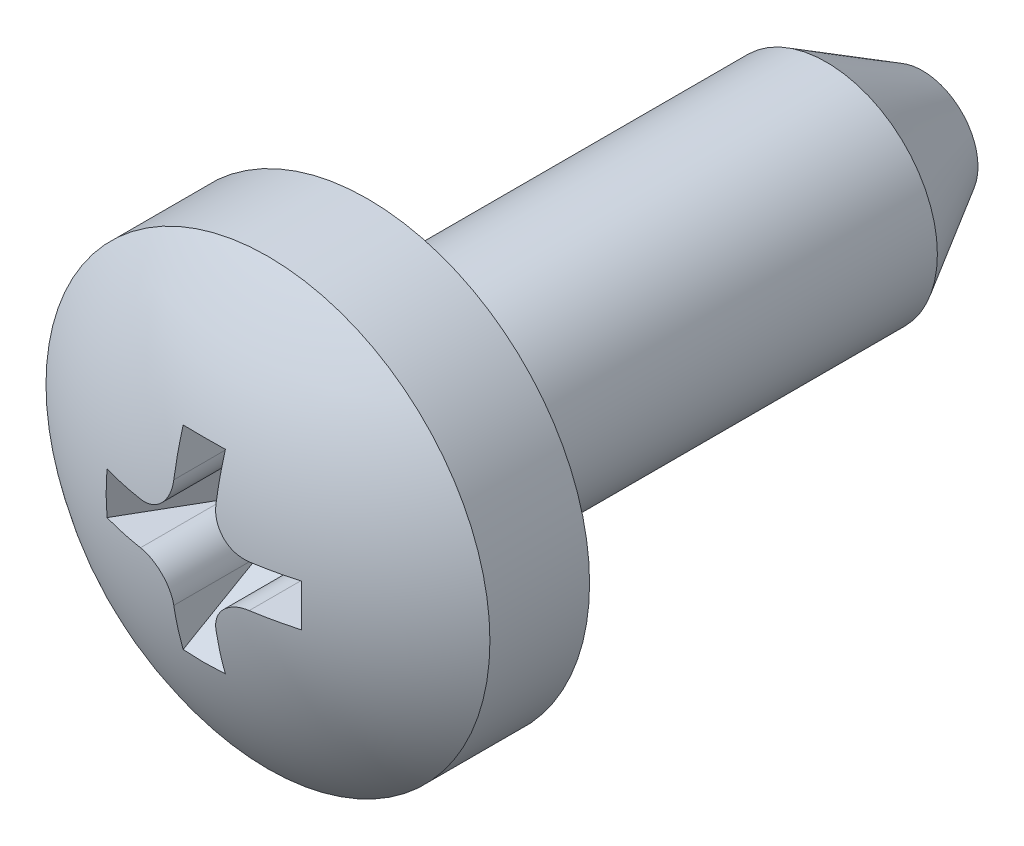
ISO-10303-21;
HEADER;
FILE_DESCRIPTION(('STEP AP214'),'2;1');
FILE_NAME('part.step','',(''),(''),'','','');
FILE_SCHEMA(('AUTOMOTIVE_DESIGN { 1 0 10303 214 1 1 1 1 }'));
ENDSEC;
DATA;
#1=APPLICATION_CONTEXT('core data for automotive mechanical design processes');
#2=APPLICATION_PROTOCOL_DEFINITION('international standard','automotive_design',2000,#1);
#3=PRODUCT_CONTEXT('',#1,'mechanical');
#4=PRODUCT('Part','Part','',(#3));
#5=PRODUCT_RELATED_PRODUCT_CATEGORY('part','',(#4));
#6=PRODUCT_DEFINITION_FORMATION('','',#4);
#7=PRODUCT_DEFINITION_CONTEXT('part definition',#1,'design');
#8=PRODUCT_DEFINITION('design','',#6,#7);
#9=PRODUCT_DEFINITION_SHAPE('','',#8);
#10=(LENGTH_UNIT() NAMED_UNIT(*) SI_UNIT(.MILLI.,.METRE.));
#11=(NAMED_UNIT(*) PLANE_ANGLE_UNIT() SI_UNIT($,.RADIAN.));
#12=(NAMED_UNIT(*) SI_UNIT($,.STERADIAN.) SOLID_ANGLE_UNIT());
#13=UNCERTAINTY_MEASURE_WITH_UNIT(LENGTH_MEASURE(1.E-05),#10,'distance_accuracy_value','');
#14=(GEOMETRIC_REPRESENTATION_CONTEXT(3) GLOBAL_UNCERTAINTY_ASSIGNED_CONTEXT((#13)) GLOBAL_UNIT_ASSIGNED_CONTEXT((#10,
#11,#12)) REPRESENTATION_CONTEXT('',''));
#15=CARTESIAN_POINT('',(0.,0.,0.));
#16=DIRECTION('',(0.,0.,1.));
#17=DIRECTION('',(1.,0.,0.));
#18=AXIS2_PLACEMENT_3D('',#15,#16,#17);
#19=CARTESIAN_POINT('',(0.,0.,-0.899999999999998));
#20=DIRECTION('',(0.,0.,1.));
#21=DIRECTION('',(1.,0.,0.));
#22=AXIS2_PLACEMENT_3D('',#19,#20,#21);
#23=PLANE('',#22);
#24=DIRECTION('',(0.,1.,0.));
#25=VECTOR('',#24,1.);
#26=CARTESIAN_POINT('',(0.430384757729351,0.,-0.900000000000006));
#27=LINE('',#26,#25);
#28=CARTESIAN_POINT('',(0.430384757729354,0.195982954764524,-0.900000000000002));
#29=VERTEX_POINT('',#28);
#30=CARTESIAN_POINT('',(0.430384757729353,-0.195982954764495,-0.900000000000002));
#31=VERTEX_POINT('',#30);
#32=EDGE_CURVE('E182',#29,#31,#27,.F.);
#33=ORIENTED_EDGE('',*,*,#32,.F.);
#34=CARTESIAN_POINT('',(0.490000000000011,0.490000000000018,-0.899999999999998));
#35=DIRECTION('',(0.,0.,1.));
#36=DIRECTION('',(1.,0.,0.));
#37=AXIS2_PLACEMENT_3D('',#34,#35,#36);
#38=CIRCLE('',#37,0.299999999999999);
#39=CARTESIAN_POINT('',(0.195982954764519,0.430384757729355,-0.899999999999994));
#40=VERTEX_POINT('',#39);
#41=EDGE_CURVE('E195',#40,#29,#38,.T.);
#42=ORIENTED_EDGE('',*,*,#41,.F.);
#43=DIRECTION('',(1.,0.,0.));
#44=VECTOR('',#43,1.);
#45=CARTESIAN_POINT('',(0.,0.430384757729357,-0.89999999999999));
#46=LINE('',#45,#44);
#47=CARTESIAN_POINT('',(-0.195982954764484,0.430384757729355,-0.899999999999994));
#48=VERTEX_POINT('',#47);
#49=EDGE_CURVE('E198',#48,#40,#46,.T.);
#50=ORIENTED_EDGE('',*,*,#49,.F.);
#51=CARTESIAN_POINT('',(-0.489999999999977,0.490000000000018,-0.899999999999998));
#52=DIRECTION('',(0.,0.,1.));
#53=DIRECTION('',(1.,0.,0.));
#54=AXIS2_PLACEMENT_3D('',#51,#52,#53);
#55=CIRCLE('',#54,0.299999999999999);
#56=CARTESIAN_POINT('',(-0.430384757729338,0.19598295476452,-0.900000000000005));
#57=VERTEX_POINT('',#56);
#58=EDGE_CURVE('E423',#57,#48,#55,.T.);
#59=ORIENTED_EDGE('',*,*,#58,.F.);
#60=DIRECTION('',(0.,1.,0.));
#61=VECTOR('',#60,1.);
#62=CARTESIAN_POINT('',(-0.430384757729334,0.,-0.900000000000012));
#63=LINE('',#62,#61);
#64=CARTESIAN_POINT('',(-0.430384757729314,-0.195982954764488,-0.900000000000047));
#65=VERTEX_POINT('',#64);
#66=EDGE_CURVE('E148',#65,#57,#63,.T.);
#67=ORIENTED_EDGE('',*,*,#66,.F.);
#68=CARTESIAN_POINT('',(-0.489999999999997,-0.489999999999977,-0.900000000000081));
#69=DIRECTION('',(0.,0.,1.));
#70=DIRECTION('',(1.,0.,0.));
#71=AXIS2_PLACEMENT_3D('',#68,#69,#70);
#72=CIRCLE('',#71,0.299999999999999);
#73=CARTESIAN_POINT('',(-0.195982954764495,-0.430384757729361,-0.90000000000005));
#74=VERTEX_POINT('',#73);
#75=EDGE_CURVE('E141',#74,#65,#72,.T.);
#76=ORIENTED_EDGE('',*,*,#75,.F.);
#77=DIRECTION('',(1.,0.,0.));
#78=VECTOR('',#77,1.);
#79=CARTESIAN_POINT('',(0.,-0.430384757729379,-0.900000000000019));
#80=LINE('',#79,#78);
#81=CARTESIAN_POINT('',(0.1959829547645,-0.430384757729385,-0.900000000000008));
#82=VERTEX_POINT('',#81);
#83=EDGE_CURVE('E145',#82,#74,#80,.F.);
#84=ORIENTED_EDGE('',*,*,#83,.F.);
#85=CARTESIAN_POINT('',(0.490000000000004,-0.48999999999999,-0.899999999999998));
#86=DIRECTION('',(0.,0.,1.));
#87=DIRECTION('',(1.,0.,0.));
#88=AXIS2_PLACEMENT_3D('',#85,#86,#87);
#89=CIRCLE('',#88,0.299999999999999);
#90=EDGE_CURVE('E179',#31,#82,#89,.T.);
#91=ORIENTED_EDGE('',*,*,#90,.F.);
#92=EDGE_LOOP('',(#33,#42,#50,#59,#67,#76,#84,#91));
#93=FACE_BOUND('',#92,.T.);
#94=ADVANCED_FACE('F17',(#93),#23,.T.);
#95=CARTESIAN_POINT('',(-0.19000000000001,-0.949999999999993,-0.900000000000109));
#96=DIRECTION('',(-1.,0.,0.));
#97=DIRECTION('',(0.,-1.,0.));
#98=AXIS2_PLACEMENT_3D('',#95,#96,#97);
#99=PLANE('',#98);
#100=DIRECTION('',(0.,0.,1.));
#101=VECTOR('',#100,1.);
#102=CARTESIAN_POINT('',(-0.189999999999998,-0.489999999999977,-0.900000000000109));
#103=LINE('',#102,#101);
#104=CARTESIAN_POINT('',(-0.189999999999998,-0.489999999999989,-0.0434512517625087));
#105=VERTEX_POINT('',#104);
#106=CARTESIAN_POINT('',(-0.189999999999992,-0.489999999999976,-0.796743371481818));
#107=VERTEX_POINT('',#106);
#108=EDGE_CURVE('E152',#105,#107,#103,.F.);
#109=ORIENTED_EDGE('',*,*,#108,.F.);
#110=CARTESIAN_POINT('',(-0.19000000000001,-0.876031893359185,-0.128116518841));
#111=CARTESIAN_POINT('',(-0.19000000000001,-0.81256698402957,-0.110021819178724));
#112=CARTESIAN_POINT('',(-0.19000000000001,-0.748665204918164,-0.0939190304243743));
#113=CARTESIAN_POINT('',(-0.190000000000009,-0.619987907131769,-0.0656972747315268));
#114=CARTESIAN_POINT('',(-0.190000000000009,-0.555212388456781,-0.053578307793029));
#115=CARTESIAN_POINT('',(-0.190000000000008,-0.490000000000002,-0.0434512517624571));
#116=B_SPLINE_CURVE_WITH_KNOTS('',3,(#110,#111,#112,#113,#114,#115),.UNSPECIFIED.,.F.,.F.,(4,2,
4),(0.,0.197698342465058,0.395396684930116),.UNSPECIFIED.);
#117=CARTESIAN_POINT('',(-0.190000000000006,-0.876031893359321,-0.128116518841095));
#118=VERTEX_POINT('',#117);
#119=EDGE_CURVE('E278',#118,#105,#116,.T.);
#120=ORIENTED_EDGE('',*,*,#119,.F.);
#121=DIRECTION('',(0.,-0.500000000000002,0.866025403784437));
#122=VECTOR('',#121,1.);
#123=CARTESIAN_POINT('',(-0.189999999999975,-0.949999999999993,-1.11075038056185E-13));
#124=LINE('',#123,#122);
#125=EDGE_CURVE('E160',#107,#118,#124,.T.);
#126=ORIENTED_EDGE('',*,*,#125,.F.);
#127=EDGE_LOOP('',(#109,#120,#126));
#128=FACE_BOUND('',#127,.T.);
#129=ADVANCED_FACE('F485',(#128),#99,.F.);
#130=CARTESIAN_POINT('',(-0.489999999999997,-0.489999999999977,-0.900000000000109));
#131=DIRECTION('',(0.,0.,1.));
#132=DIRECTION('',(1.,0.,0.));
#133=AXIS2_PLACEMENT_3D('',#130,#131,#132);
#134=CYLINDRICAL_SURFACE('',#133,0.299999999999999);
#135=ORIENTED_EDGE('',*,*,#108,.T.);
#136=CARTESIAN_POINT('',(-0.489999999999997,-0.489999999999977,-0.796743371481818));
#137=DIRECTION('',(0.,0.866025403784437,0.500000000000002));
#138=DIRECTION('',(0.,-0.500000000000002,0.866025403784437));
#139=AXIS2_PLACEMENT_3D('',#136,#137,#138);
#140=ELLIPSE('',#139,0.599999999999996,0.299999999999999);
#141=EDGE_CURVE('E155',#74,#107,#140,.F.);
#142=ORIENTED_EDGE('',*,*,#141,.F.);
#143=ORIENTED_EDGE('',*,*,#75,.T.);
#144=CARTESIAN_POINT('',(-0.489999999999997,-0.489999999999977,-0.796743371481696));
#145=DIRECTION('',(0.866025403784437,0.,0.500000000000003));
#146=DIRECTION('',(-0.500000000000003,0.,0.866025403784437));
#147=AXIS2_PLACEMENT_3D('',#144,#145,#146);
#148=ELLIPSE('',#147,0.599999999999995,0.299999999999999);
#149=CARTESIAN_POINT('',(-0.490000000000001,-0.189999999999966,-0.79674337148169));
#150=VERTEX_POINT('',#149);
#151=EDGE_CURVE('E419',#150,#65,#148,.F.);
#152=ORIENTED_EDGE('',*,*,#151,.F.);
#153=DIRECTION('',(0.,0.,1.));
#154=VECTOR('',#153,1.);
#155=CARTESIAN_POINT('',(-0.490000000000004,-0.189999999999954,-0.899999999999998));
#156=LINE('',#155,#154);
#157=CARTESIAN_POINT('',(-0.489999999999966,-0.189999999999951,-0.0434512517624565));
#158=VERTEX_POINT('',#157);
#159=EDGE_CURVE('E414',#150,#158,#156,.T.);
#160=ORIENTED_EDGE('',*,*,#159,.T.);
#161=CARTESIAN_POINT('',(-0.189999999999997,-0.490000000000001,-0.0434512517624554));
#162=CARTESIAN_POINT('',(-0.189985118650612,-0.473411379798215,-0.0408738792864558));
#163=CARTESIAN_POINT('',(-0.191375278695282,-0.456787768840949,-0.0385122771032349));
#164=CARTESIAN_POINT('',(-0.196894186811312,-0.423940003446388,-0.0342793800409083));
#165=CARTESIAN_POINT('',(-0.201022565678485,-0.407715795461933,-0.032408019108205));
#166=CARTESIAN_POINT('',(-0.211951868052268,-0.376115887487568,-0.0292120608090135));
#167=CARTESIAN_POINT('',(-0.218755438046987,-0.360741044980429,-0.0278880075467508));
#168=CARTESIAN_POINT('',(-0.234850873869074,-0.331318535223753,-0.0258300217688972));
#169=CARTESIAN_POINT('',(-0.2441416811264,-0.317270306799068,-0.0250958387347367));
#170=CARTESIAN_POINT('',(-0.264821536891633,-0.291078791930215,-0.0242453088972533));
#171=CARTESIAN_POINT('',(-0.276182876838711,-0.278913869511609,-0.0241213464347972));
#172=CARTESIAN_POINT('',(-0.300753668827425,-0.256631575124852,-0.0244744541239593));
#173=CARTESIAN_POINT('',(-0.313963074269493,-0.24651415154409,-0.0249515091231557));
#174=CARTESIAN_POINT('',(-0.341764744102581,-0.228661562376391,-0.0264873092536452));
#175=CARTESIAN_POINT('',(-0.356348730535629,-0.220913196188939,-0.0275427360848449));
#176=CARTESIAN_POINT('',(-0.386546086391104,-0.207923368663484,-0.0302016326970138));
#177=CARTESIAN_POINT('',(-0.402159222178122,-0.202681340556718,-0.0318049784340216));
#178=CARTESIAN_POINT('',(-0.429857051485601,-0.195839032887792,-0.0350324303206799));
#179=CARTESIAN_POINT('',(-0.441812982542519,-0.19364814820214,-0.0365444874337845));
#180=CARTESIAN_POINT('',(-0.465850847795997,-0.190728247711537,-0.0398172277992845));
#181=CARTESIAN_POINT('',(-0.477932576033909,-0.189997133878124,-0.0415775503325651));
#182=CARTESIAN_POINT('',(-0.489999999999929,-0.189999999999977,-0.043451251762445));
#183=B_SPLINE_CURVE_WITH_KNOTS('',3,(#161,#162,#163,#164,#165,#166,#167,#168,#169,#170,#171,
#172,#173,#174,#175,#176,#177,#178,#179,#180,#181,#182),.UNSPECIFIED.,.F.,.F.,(4,2,2,2,2,2,2,2,
2,2,4),(0.,0.0503063839545407,0.100605986291514,0.15095547425032,0.201283567403031,
0.25098193625596,0.300679052174287,0.350093980807058,0.39949772974305,0.436157190577099,
0.472763925248286),.UNSPECIFIED.);
#184=EDGE_CURVE('E460',#105,#158,#183,.T.);
#185=ORIENTED_EDGE('',*,*,#184,.F.);
#186=EDGE_LOOP('',(#135,#142,#143,#152,#160,#185));
#187=FACE_BOUND('',#186,.T.);
#188=ADVANCED_FACE('F156',(#187),#134,.T.);
#189=CARTESIAN_POINT('',(-0.189999999999954,-0.189999999999954,-0.899999999999998));
#190=DIRECTION('',(0.,-1.,0.));
#191=DIRECTION('',(1.,0.,0.));
#192=AXIS2_PLACEMENT_3D('',#189,#190,#191);
#193=PLANE('',#192);
#194=ORIENTED_EDGE('',*,*,#159,.F.);
#195=DIRECTION('',(0.500000000000003,0.,-0.866025403784437));
#196=VECTOR('',#195,1.);
#197=CARTESIAN_POINT('',(-0.949999999999992,-0.189999999999996,0.));
#198=LINE('',#197,#196);
#199=CARTESIAN_POINT('',(-0.876031893359464,-0.189999999999972,-0.128116518841094));
#200=VERTEX_POINT('',#199);
#201=EDGE_CURVE('E416',#200,#150,#198,.T.);
#202=ORIENTED_EDGE('',*,*,#201,.F.);
#203=CARTESIAN_POINT('',(0.,-0.189999999999947,-3.2));
#204=DIRECTION('',(0.,1.,0.));
#205=DIRECTION('',(0.,0.,1.));
#206=AXIS2_PLACEMENT_3D('',#203,#204,#205);
#207=CIRCLE('',#206,3.19435439486605);
#208=EDGE_CURVE('E464',#158,#200,#207,.F.);
#209=ORIENTED_EDGE('',*,*,#208,.F.);
#210=EDGE_LOOP('',(#194,#202,#209));
#211=FACE_BOUND('',#210,.T.);
#212=ADVANCED_FACE('F465',(#211),#193,.F.);
#213=CARTESIAN_POINT('',(-0.949999999999993,0.,0.));
#214=DIRECTION('',(0.866025403784437,0.,0.500000000000003));
#215=DIRECTION('',(0.500000000000003,0.,-0.866025403784437));
#216=AXIS2_PLACEMENT_3D('',#213,#214,#215);
#217=PLANE('',#216);
#218=DIRECTION('',(-0.499999999999991,0.,0.866025403784444));
#219=VECTOR('',#218,1.);
#220=CARTESIAN_POINT('',(-0.490000000000004,0.189999999999996,-0.796743371481681));
#221=LINE('',#220,#219);
#222=CARTESIAN_POINT('',(-0.489999999999987,0.190000000000013,-0.796743371481713));
#223=VERTEX_POINT('',#222);
#224=CARTESIAN_POINT('',(-0.876031893359463,0.189999999999996,-0.128116518841085));
#225=VERTEX_POINT('',#224);
#226=EDGE_CURVE('E421',#223,#225,#221,.T.);
#227=ORIENTED_EDGE('',*,*,#226,.T.);
#228=CARTESIAN_POINT('',(-0.876031893359471,-0.189999999999992,-0.128116518841083));
#229=CARTESIAN_POINT('',(-0.877971968037758,-0.126666666666658,-0.124756210927812));
#230=CARTESIAN_POINT('',(-0.878942005376901,-0.0633333333333236,-0.123076056971177));
#231=CARTESIAN_POINT('',(-0.878942005376901,0.0633333333333446,-0.123076056971178));
#232=CARTESIAN_POINT('',(-0.877971968037757,0.126666666666679,-0.124756210927814));
#233=CARTESIAN_POINT('',(-0.87603189335947,0.190000000000013,-0.128116518841087));
#234=B_SPLINE_CURVE_WITH_KNOTS('',3,(#228,#229,#230,#231,#232,#233),.UNSPECIFIED.,.F.,.F.,(4,2,
4),(0.,0.190089123854619,0.380178247709239),.UNSPECIFIED.);
#235=EDGE_CURVE('E467',#200,#225,#234,.T.);
#236=ORIENTED_EDGE('',*,*,#235,.F.);
#237=ORIENTED_EDGE('',*,*,#201,.T.);
#238=ORIENTED_EDGE('',*,*,#151,.T.);
#239=ORIENTED_EDGE('',*,*,#66,.T.);
#240=CARTESIAN_POINT('',(-0.489999999999977,0.490000000000018,-0.796743371481733));
#241=DIRECTION('',(0.866025403784437,0.,0.500000000000003));
#242=DIRECTION('',(-0.500000000000003,0.,0.866025403784437));
#243=AXIS2_PLACEMENT_3D('',#240,#241,#242);
#244=ELLIPSE('',#243,0.599999999999995,0.299999999999999);
#245=EDGE_CURVE('E427',#223,#57,#244,.T.);
#246=ORIENTED_EDGE('',*,*,#245,.F.);
#247=EDGE_LOOP('',(#227,#236,#237,#238,#239,#246));
#248=FACE_BOUND('',#247,.T.);
#249=ADVANCED_FACE('F455',(#248),#217,.T.);
#250=CARTESIAN_POINT('',(-0.189999999999982,0.189999999999996,-0.899999999999998));
#251=DIRECTION('',(0.,1.,0.));
#252=DIRECTION('',(-1.,0.,0.));
#253=AXIS2_PLACEMENT_3D('',#250,#251,#252);
#254=PLANE('',#253);
#255=DIRECTION('',(0.,0.,1.));
#256=VECTOR('',#255,1.);
#257=CARTESIAN_POINT('',(-0.489999999999997,0.190000000000019,-0.899999999999998));
#258=LINE('',#257,#256);
#259=CARTESIAN_POINT('',(-0.489999999999997,0.190000000000011,-0.0434512517624582));
#260=VERTEX_POINT('',#259);
#261=EDGE_CURVE('E424',#260,#223,#258,.F.);
#262=ORIENTED_EDGE('',*,*,#261,.F.);
#263=CARTESIAN_POINT('',(0.,0.190000000000003,-3.2));
#264=DIRECTION('',(0.,1.,0.));
#265=DIRECTION('',(0.,0.,1.));
#266=AXIS2_PLACEMENT_3D('',#263,#264,#265);
#267=CIRCLE('',#266,3.19435439486604);
#268=EDGE_CURVE('E517',#225,#260,#267,.T.);
#269=ORIENTED_EDGE('',*,*,#268,.F.);
#270=ORIENTED_EDGE('',*,*,#226,.F.);
#271=EDGE_LOOP('',(#262,#269,#270));
#272=FACE_BOUND('',#271,.T.);
#273=ADVANCED_FACE('F518',(#272),#254,.F.);
#274=CARTESIAN_POINT('',(-0.489999999999977,0.490000000000018,-0.899999999999998));
#275=DIRECTION('',(0.,0.,1.));
#276=DIRECTION('',(1.,0.,0.));
#277=AXIS2_PLACEMENT_3D('',#274,#275,#276);
#278=CYLINDRICAL_SURFACE('',#277,0.299999999999999);
#279=ORIENTED_EDGE('',*,*,#261,.T.);
#280=ORIENTED_EDGE('',*,*,#245,.T.);
#281=ORIENTED_EDGE('',*,*,#58,.T.);
#282=CARTESIAN_POINT('',(-0.489999999999977,0.490000000000018,-0.796743371481678));
#283=DIRECTION('',(0.,-0.866025403784437,0.500000000000003));
#284=DIRECTION('',(0.,0.500000000000003,0.866025403784437));
#285=AXIS2_PLACEMENT_3D('',#282,#283,#284);
#286=ELLIPSE('',#285,0.599999999999996,0.299999999999999);
#287=CARTESIAN_POINT('',(-0.189999999999986,0.490000000000032,-0.796743371481654));
#288=VERTEX_POINT('',#287);
#289=EDGE_CURVE('E430',#288,#48,#286,.F.);
#290=ORIENTED_EDGE('',*,*,#289,.F.);
#291=DIRECTION('',(0.,0.,1.));
#292=VECTOR('',#291,1.);
#293=CARTESIAN_POINT('',(-0.189999999999982,0.490000000000046,-0.899999999999998));
#294=LINE('',#293,#292);
#295=CARTESIAN_POINT('',(-0.189999999999981,0.490000000000031,-0.0434512517624593));
#296=VERTEX_POINT('',#295);
#297=EDGE_CURVE('E431',#288,#296,#294,.T.);
#298=ORIENTED_EDGE('',*,*,#297,.T.);
#299=CARTESIAN_POINT('',(-0.489999999999997,0.190000000000019,-0.0434512517624589));
#300=CARTESIAN_POINT('',(-0.473411379798213,0.189985118650633,-0.0408738792864586));
#301=CARTESIAN_POINT('',(-0.456787768840947,0.191375278695304,-0.0385122771032378));
#302=CARTESIAN_POINT('',(-0.423940003446386,0.196894186811333,-0.0342793800409117));
#303=CARTESIAN_POINT('',(-0.407715795461932,0.201022565678505,-0.032408019108209));
#304=CARTESIAN_POINT('',(-0.376115887487569,0.211951868052287,-0.0292120608090182));
#305=CARTESIAN_POINT('',(-0.360741044980431,0.218755438047007,-0.0278880075467555));
#306=CARTESIAN_POINT('',(-0.331318535223757,0.234850873869093,-0.0258300217689021));
#307=CARTESIAN_POINT('',(-0.317270306799072,0.244141681126419,-0.0250958387347418));
#308=CARTESIAN_POINT('',(-0.291078791930219,0.264821536891651,-0.0242453088972585));
#309=CARTESIAN_POINT('',(-0.278913869511613,0.276182876838729,-0.0241213464348024));
#310=CARTESIAN_POINT('',(-0.256631575124855,0.300753668827442,-0.0244744541239644));
#311=CARTESIAN_POINT('',(-0.246514151544093,0.31396307426951,-0.0249515091231607));
#312=CARTESIAN_POINT('',(-0.228661562376394,0.341764744102598,-0.0264873092536506));
#313=CARTESIAN_POINT('',(-0.220913196188941,0.356348730535645,-0.0275427360848507));
#314=CARTESIAN_POINT('',(-0.207923368663486,0.38654608639112,-0.0302016326970192));
#315=CARTESIAN_POINT('',(-0.202681340556719,0.402159222178137,-0.0318049784340262));
#316=CARTESIAN_POINT('',(-0.19583903288779,0.429857051485628,-0.0350324303206855));
#317=CARTESIAN_POINT('',(-0.193648148202136,0.441812982542558,-0.0365444874337919));
#318=CARTESIAN_POINT('',(-0.190728247711533,0.465850847796059,-0.0398172277992959));
#319=CARTESIAN_POINT('',(-0.189997133878122,0.477932576033983,-0.0415775503325788));
#320=CARTESIAN_POINT('',(-0.189999999999977,0.490000000000015,-0.0434512517624606));
#321=B_SPLINE_CURVE_WITH_KNOTS('',3,(#299,#300,#301,#302,#303,#304,#305,#306,#307,#308,#309,
#310,#311,#312,#313,#314,#315,#316,#317,#318,#319,#320),.UNSPECIFIED.,.F.,.F.,(4,2,2,2,2,2,2,2,
2,2,4),(0.,0.0503063839545388,0.10060598629151,0.150955474250314,0.201283567403022,
0.250981936255952,0.300679052174278,0.350093980807049,0.399497729743041,0.436157190577125,
0.472763925248347),.UNSPECIFIED.);
#322=EDGE_CURVE('E241',#260,#296,#321,.T.);
#323=ORIENTED_EDGE('',*,*,#322,.F.);
#324=EDGE_LOOP('',(#279,#280,#281,#290,#298,#323));
#325=FACE_BOUND('',#324,.T.);
#326=ADVANCED_FACE('F227',(#325),#278,.T.);
#327=CARTESIAN_POINT('',(-0.189999999999982,0.189999999999996,-0.899999999999998));
#328=DIRECTION('',(-1.,0.,0.));
#329=DIRECTION('',(0.,-1.,0.));
#330=AXIS2_PLACEMENT_3D('',#327,#328,#329);
#331=PLANE('',#330);
#332=ORIENTED_EDGE('',*,*,#297,.F.);
#333=DIRECTION('',(0.,-0.500000000000003,-0.866025403784437));
#334=VECTOR('',#333,1.);
#335=CARTESIAN_POINT('',(-0.19000000000001,0.950000000000034,0.));
#336=LINE('',#335,#334);
#337=CARTESIAN_POINT('',(-0.19000000000001,0.876031893359489,-0.128116518841069));
#338=VERTEX_POINT('',#337);
#339=EDGE_CURVE('E428',#338,#288,#336,.T.);
#340=ORIENTED_EDGE('',*,*,#339,.F.);
#341=CARTESIAN_POINT('',(-0.189999999999981,0.490000000000015,-0.0434512517624606));
#342=CARTESIAN_POINT('',(-0.189999999999981,0.55521238840394,-0.0535783077848166));
#343=CARTESIAN_POINT('',(-0.189999999999982,0.61998790702688,-0.0656972747119004));
#344=CARTESIAN_POINT('',(-0.189999999999982,0.74866520471079,-0.093919030375524));
#345=CARTESIAN_POINT('',(-0.189999999999982,0.812566983771759,-0.110021819112064));
#346=CARTESIAN_POINT('',(-0.189999999999982,0.876031893051743,-0.128116518753331));
#347=B_SPLINE_CURVE_WITH_KNOTS('',3,(#341,#342,#343,#344,#345,#346),.UNSPECIFIED.,.F.,.F.,(4,2,
4),(0.,0.197698342305279,0.395396684610558),.UNSPECIFIED.);
#348=EDGE_CURVE('E232',#296,#338,#347,.T.);
#349=ORIENTED_EDGE('',*,*,#348,.F.);
#350=EDGE_LOOP('',(#332,#340,#349));
#351=FACE_BOUND('',#350,.T.);
#352=ADVANCED_FACE('F219',(#351),#331,.F.);
#353=CARTESIAN_POINT('',(0.,0.950000000000034,0.));
#354=DIRECTION('',(0.,-0.866025403784437,0.500000000000003));
#355=DIRECTION('',(0.,-0.500000000000003,-0.866025403784437));
#356=AXIS2_PLACEMENT_3D('',#353,#354,#355);
#357=PLANE('',#356);
#358=CARTESIAN_POINT('',(0.190000000000017,0.876031893359492,-0.128116518841063));
#359=CARTESIAN_POINT('',(0.0950891447566933,0.878942005376886,-0.123076056971221));
#360=CARTESIAN_POINT('',(0.,0.878942005376886,-0.123076056971221));
#361=B_SPLINE_CURVE_WITH_KNOTS('',2,(#358,#359,#360),.UNSPECIFIED.,.F.,.F.,(3,3),(0.,1.),.UNSPECIFIED.);
#362=CARTESIAN_POINT('',(0.,0.878942005376886,-0.123076056971221));
#363=VERTEX_POINT('',#362);
#364=CARTESIAN_POINT('',(0.189999999999996,0.876031893359329,-0.128116518841031));
#365=VERTEX_POINT('',#364);
#366=EDGE_CURVE('E199',#363,#365,#361,.F.);
#367=ORIENTED_EDGE('',*,*,#366,.F.);
#368=CARTESIAN_POINT('',(0.,0.878942005376886,-0.123076056971221));
#369=CARTESIAN_POINT('',(-0.0950891447566401,0.878942005376886,-0.123076056971221));
#370=CARTESIAN_POINT('',(-0.19000000000001,0.876031893359489,-0.128116518841069));
#371=B_SPLINE_CURVE_WITH_KNOTS('',2,(#368,#369,#370),.UNSPECIFIED.,.F.,.F.,(3,3),(0.,1.),.UNSPECIFIED.);
#372=EDGE_CURVE('E205',#338,#363,#371,.F.);
#373=ORIENTED_EDGE('',*,*,#372,.F.);
#374=ORIENTED_EDGE('',*,*,#339,.T.);
#375=ORIENTED_EDGE('',*,*,#289,.T.);
#376=ORIENTED_EDGE('',*,*,#49,.T.);
#377=CARTESIAN_POINT('',(0.490000000000011,0.490000000000018,-0.796743371481678));
#378=DIRECTION('',(0.,-0.866025403784437,0.500000000000003));
#379=DIRECTION('',(0.,0.500000000000003,0.866025403784437));
#380=AXIS2_PLACEMENT_3D('',#377,#378,#379);
#381=ELLIPSE('',#380,0.599999999999996,0.299999999999999);
#382=CARTESIAN_POINT('',(0.190000000000012,0.490000000000011,-0.79674337148169));
#383=VERTEX_POINT('',#382);
#384=EDGE_CURVE('E191',#383,#40,#381,.T.);
#385=ORIENTED_EDGE('',*,*,#384,.F.);
#386=DIRECTION('',(0.,0.500000000000005,0.866025403784436));
#387=VECTOR('',#386,1.);
#388=CARTESIAN_POINT('',(0.189999999999996,0.490000000000018,-0.796743371481654));
#389=LINE('',#388,#387);
#390=EDGE_CURVE('E196',#383,#365,#389,.T.);
#391=ORIENTED_EDGE('',*,*,#390,.T.);
#392=EDGE_LOOP('',(#367,#373,#374,#375,#376,#385,#391));
#393=FACE_BOUND('',#392,.T.);
#394=ADVANCED_FACE('F208',(#393),#357,.T.);
#395=CARTESIAN_POINT('',(0.189999999999996,0.189999999999996,-0.899999999999998));
#396=DIRECTION('',(1.,0.,0.));
#397=DIRECTION('',(0.,1.,0.));
#398=AXIS2_PLACEMENT_3D('',#395,#396,#397);
#399=PLANE('',#398);
#400=DIRECTION('',(0.,0.,1.));
#401=VECTOR('',#400,1.);
#402=CARTESIAN_POINT('',(0.190000000000012,0.490000000000004,-0.89999999999997));
#403=LINE('',#402,#401);
#404=CARTESIAN_POINT('',(0.190000000000012,0.490000000000002,-0.0434512517624454));
#405=VERTEX_POINT('',#404);
#406=EDGE_CURVE('E192',#405,#383,#403,.F.);
#407=ORIENTED_EDGE('',*,*,#406,.F.);
#408=CARTESIAN_POINT('',(0.189999999999997,0.876031893359176,-0.128116518841003));
#409=CARTESIAN_POINT('',(0.189999999999997,0.812566984029562,-0.110021819178728));
#410=CARTESIAN_POINT('',(0.189999999999996,0.748665204918157,-0.0939190304243789));
#411=CARTESIAN_POINT('',(0.189999999999995,0.619987907131765,-0.0656972747315307));
#412=CARTESIAN_POINT('',(0.189999999999995,0.555212388456778,-0.0535783077930321));
#413=CARTESIAN_POINT('',(0.189999999999994,0.49,-0.0434512517624589));
#414=B_SPLINE_CURVE_WITH_KNOTS('',3,(#408,#409,#410,#411,#412,#413),.UNSPECIFIED.,.F.,.F.,(4,2,
4),(0.,0.197698342465054,0.395396684930109),.UNSPECIFIED.);
#415=EDGE_CURVE('E204',#365,#405,#414,.T.);
#416=ORIENTED_EDGE('',*,*,#415,.F.);
#417=ORIENTED_EDGE('',*,*,#390,.F.);
#418=EDGE_LOOP('',(#407,#416,#417));
#419=FACE_BOUND('',#418,.T.);
#420=ADVANCED_FACE('F218',(#419),#399,.F.);
#421=CARTESIAN_POINT('',(0.490000000000011,0.490000000000018,-0.89999999999997));
#422=DIRECTION('',(0.,0.,1.));
#423=DIRECTION('',(1.,0.,0.));
#424=AXIS2_PLACEMENT_3D('',#421,#422,#423);
#425=CYLINDRICAL_SURFACE('',#424,0.299999999999999);
#426=ORIENTED_EDGE('',*,*,#406,.T.);
#427=ORIENTED_EDGE('',*,*,#384,.T.);
#428=ORIENTED_EDGE('',*,*,#41,.T.);
#429=CARTESIAN_POINT('',(0.490000000000011,0.490000000000018,-0.796743371481696));
#430=DIRECTION('',(-0.866025403784438,0.,0.500000000000002));
#431=DIRECTION('',(0.500000000000002,0.,0.866025403784438));
#432=AXIS2_PLACEMENT_3D('',#429,#430,#431);
#433=ELLIPSE('',#432,0.599999999999997,0.299999999999999);
#434=CARTESIAN_POINT('',(0.490000000000008,0.190000000000035,-0.796743371481702));
#435=VERTEX_POINT('',#434);
#436=EDGE_CURVE('E185',#435,#29,#433,.F.);
#437=ORIENTED_EDGE('',*,*,#436,.F.);
#438=DIRECTION('',(0.,0.,1.));
#439=VECTOR('',#438,1.);
#440=CARTESIAN_POINT('',(0.490000000000004,0.190000000000051,-0.899999999999998));
#441=LINE('',#440,#439);
#442=CARTESIAN_POINT('',(0.490000000000018,0.190000000000055,-0.0434512517624597));
#443=VERTEX_POINT('',#442);
#444=EDGE_CURVE('E189',#435,#443,#441,.T.);
#445=ORIENTED_EDGE('',*,*,#444,.T.);
#446=CARTESIAN_POINT('',(0.190000000000012,0.49,-0.0434512517624606));
#447=CARTESIAN_POINT('',(0.189985118650628,0.473411379798214,-0.0408738792864607));
#448=CARTESIAN_POINT('',(0.191375278695301,0.456787768840948,-0.0385122771032397));
#449=CARTESIAN_POINT('',(0.196894186811335,0.423940003446388,-0.0342793800409131));
#450=CARTESIAN_POINT('',(0.201022565678509,0.407715795461933,-0.03240801910821));
#451=CARTESIAN_POINT('',(0.211951868052297,0.37611588748757,-0.0292120608090189));
#452=CARTESIAN_POINT('',(0.218755438047019,0.360741044980433,-0.0278880075467565));
#453=CARTESIAN_POINT('',(0.23485087386911,0.331318535223759,-0.025830021768903));
#454=CARTESIAN_POINT('',(0.244141681126438,0.317270306799076,-0.0250958387347424));
#455=CARTESIAN_POINT('',(0.264821536891675,0.291078791930225,-0.0242453088972597));
#456=CARTESIAN_POINT('',(0.276182876838754,0.278913869511621,-0.0241213464348045));
#457=CARTESIAN_POINT('',(0.300753668827471,0.256631575124867,-0.0244744541239675));
#458=CARTESIAN_POINT('',(0.313963074269541,0.246514151544107,-0.024951509123164));
#459=CARTESIAN_POINT('',(0.341764744102632,0.228661562376412,-0.0264873092536542));
#460=CARTESIAN_POINT('',(0.35634873053568,0.220913196188962,-0.0275427360848544));
#461=CARTESIAN_POINT('',(0.386546086391157,0.207923368663512,-0.0302016326970239));
#462=CARTESIAN_POINT('',(0.402159222178175,0.202681340556747,-0.0318049784340318));
#463=CARTESIAN_POINT('',(0.429857051485663,0.195839032887823,-0.0350324303206914));
#464=CARTESIAN_POINT('',(0.441812982542589,0.193648148202172,-0.0365444874337973));
#465=CARTESIAN_POINT('',(0.465850847796082,0.190728247711573,-0.0398172277993002));
#466=CARTESIAN_POINT('',(0.477932576034003,0.189997133878162,-0.0415775503325825));
#467=CARTESIAN_POINT('',(0.49000000000003,0.190000000000019,-0.0434512517624641));
#468=B_SPLINE_CURVE_WITH_KNOTS('',3,(#446,#447,#448,#449,#450,#451,#452,#453,#454,#455,#456,
#457,#458,#459,#460,#461,#462,#463,#464,#465,#466,#467),.UNSPECIFIED.,.F.,.F.,(4,2,2,2,2,2,2,2,
2,2,4),(0.,0.0503063839545404,0.100605986291513,0.150955474250319,0.20128356740303,
0.250981936255959,0.300679052174286,0.350093980807056,0.399497729743048,0.43615719057712,
0.47276392524833),.UNSPECIFIED.);
#469=EDGE_CURVE('E345',#405,#443,#468,.T.);
#470=ORIENTED_EDGE('',*,*,#469,.F.);
#471=EDGE_LOOP('',(#426,#427,#428,#437,#445,#470));
#472=FACE_BOUND('',#471,.T.);
#473=ADVANCED_FACE('F351',(#472),#425,.T.);
#474=CARTESIAN_POINT('',(0.95000000000002,0.190000000000051,-0.899999999999998));
#475=DIRECTION('',(0.,1.,0.));
#476=DIRECTION('',(-1.,0.,0.));
#477=AXIS2_PLACEMENT_3D('',#474,#475,#476);
#478=PLANE('',#477);
#479=ORIENTED_EDGE('',*,*,#444,.F.);
#480=DIRECTION('',(0.500000000000002,0.,0.866025403784438));
#481=VECTOR('',#480,1.);
#482=CARTESIAN_POINT('',(0.95000000000002,0.189999999999996,0.));
#483=LINE('',#482,#481);
#484=CARTESIAN_POINT('',(0.876031893359478,0.190000000000027,-0.128116518841092));
#485=VERTEX_POINT('',#484);
#486=EDGE_CURVE('E186',#485,#435,#483,.F.);
#487=ORIENTED_EDGE('',*,*,#486,.F.);
#488=CARTESIAN_POINT('',(0.,0.19000000000006,-3.2));
#489=DIRECTION('',(0.,1.,0.));
#490=DIRECTION('',(0.,0.,1.));
#491=AXIS2_PLACEMENT_3D('',#488,#489,#490);
#492=CIRCLE('',#491,3.19435439486604);
#493=EDGE_CURVE('E343',#443,#485,#492,.T.);
#494=ORIENTED_EDGE('',*,*,#493,.F.);
#495=EDGE_LOOP('',(#479,#487,#494));
#496=FACE_BOUND('',#495,.T.);
#497=ADVANCED_FACE('F334',(#496),#478,.F.);
#498=CARTESIAN_POINT('',(0.95000000000002,0.,0.));
#499=DIRECTION('',(-0.866025403784438,0.,0.500000000000002));
#500=DIRECTION('',(0.500000000000002,0.,0.866025403784438));
#501=AXIS2_PLACEMENT_3D('',#498,#499,#500);
#502=PLANE('',#501);
#503=DIRECTION('',(0.500000000000028,0.,0.866025403784423));
#504=VECTOR('',#503,1.);
#505=CARTESIAN_POINT('',(0.490000000000004,-0.189999999999982,-0.796743371481681));
#506=LINE('',#505,#504);
#507=CARTESIAN_POINT('',(0.490000000000018,-0.189999999999989,-0.79674337148167));
#508=VERTEX_POINT('',#507);
#509=CARTESIAN_POINT('',(0.876031893359489,-0.189999999999982,-0.128116518841082));
#510=VERTEX_POINT('',#509);
#511=EDGE_CURVE('E180',#508,#510,#506,.T.);
#512=ORIENTED_EDGE('',*,*,#511,.T.);
#513=CARTESIAN_POINT('',(0.87603189335948,0.190000000000001,-0.128116518841089));
#514=CARTESIAN_POINT('',(0.877971968037767,0.126666666666676,-0.124756210927817));
#515=CARTESIAN_POINT('',(0.878942005376911,0.0633333333333515,-0.123076056971181));
#516=CARTESIAN_POINT('',(0.878942005376912,-0.0633333333332982,-0.123076056971179));
#517=CARTESIAN_POINT('',(0.877971968037769,-0.126666666666623,-0.124756210927814));
#518=CARTESIAN_POINT('',(0.876031893359483,-0.189999999999948,-0.128116518841084));
#519=B_SPLINE_CURVE_WITH_KNOTS('',3,(#513,#514,#515,#516,#517,#518),.UNSPECIFIED.,.F.,.F.,(4,2,
4),(0.,0.190089123854592,0.380178247709184),.UNSPECIFIED.);
#520=EDGE_CURVE('E336',#485,#510,#519,.T.);
#521=ORIENTED_EDGE('',*,*,#520,.F.);
#522=ORIENTED_EDGE('',*,*,#486,.T.);
#523=ORIENTED_EDGE('',*,*,#436,.T.);
#524=ORIENTED_EDGE('',*,*,#32,.T.);
#525=CARTESIAN_POINT('',(0.490000000000004,-0.48999999999999,-0.796743371481707));
#526=DIRECTION('',(-0.866025403784438,0.,0.500000000000002));
#527=DIRECTION('',(0.500000000000002,0.,0.866025403784438));
#528=AXIS2_PLACEMENT_3D('',#525,#526,#527);
#529=ELLIPSE('',#528,0.599999999999997,0.299999999999999);
#530=EDGE_CURVE('E175',#508,#31,#529,.T.);
#531=ORIENTED_EDGE('',*,*,#530,.F.);
#532=EDGE_LOOP('',(#512,#521,#522,#523,#524,#531));
#533=FACE_BOUND('',#532,.T.);
#534=ADVANCED_FACE('F329',(#533),#502,.T.);
#535=CARTESIAN_POINT('',(0.950000000000006,-0.189999999999982,-0.899999999999998));
#536=DIRECTION('',(0.,-1.,0.));
#537=DIRECTION('',(1.,0.,0.));
#538=AXIS2_PLACEMENT_3D('',#535,#536,#537);
#539=PLANE('',#538);
#540=DIRECTION('',(0.,0.,1.));
#541=VECTOR('',#540,1.);
#542=CARTESIAN_POINT('',(0.490000000000032,-0.189999999999991,-0.899999999999998));
#543=LINE('',#542,#541);
#544=CARTESIAN_POINT('',(0.490000000000032,-0.189999999999983,-0.0434512517624593));
#545=VERTEX_POINT('',#544);
#546=EDGE_CURVE('E176',#545,#508,#543,.F.);
#547=ORIENTED_EDGE('',*,*,#546,.F.);
#548=CARTESIAN_POINT('',(0.,-0.189999999999975,-3.2));
#549=DIRECTION('',(0.,1.,0.));
#550=DIRECTION('',(0.,0.,1.));
#551=AXIS2_PLACEMENT_3D('',#548,#549,#550);
#552=CIRCLE('',#551,3.19435439486605);
#553=EDGE_CURVE('E304',#510,#545,#552,.F.);
#554=ORIENTED_EDGE('',*,*,#553,.F.);
#555=ORIENTED_EDGE('',*,*,#511,.F.);
#556=EDGE_LOOP('',(#547,#554,#555));
#557=FACE_BOUND('',#556,.T.);
#558=ADVANCED_FACE('F325',(#557),#539,.F.);
#559=CARTESIAN_POINT('',(0.490000000000004,-0.48999999999999,-0.899999999999998));
#560=DIRECTION('',(0.,0.,1.));
#561=DIRECTION('',(1.,0.,0.));
#562=AXIS2_PLACEMENT_3D('',#559,#560,#561);
#563=CYLINDRICAL_SURFACE('',#562,0.299999999999999);
#564=ORIENTED_EDGE('',*,*,#546,.T.);
#565=ORIENTED_EDGE('',*,*,#530,.T.);
#566=ORIENTED_EDGE('',*,*,#90,.T.);
#567=CARTESIAN_POINT('',(0.490000000000004,-0.48999999999999,-0.796743371481793));
#568=DIRECTION('',(0.,0.866025403784437,0.500000000000002));
#569=DIRECTION('',(0.,-0.500000000000002,0.866025403784437));
#570=AXIS2_PLACEMENT_3D('',#567,#568,#569);
#571=ELLIPSE('',#570,0.599999999999996,0.299999999999999);
#572=CARTESIAN_POINT('',(0.189999999999993,-0.489999999999984,-0.796743371481805));
#573=VERTEX_POINT('',#572);
#574=EDGE_CURVE('E165',#573,#82,#571,.F.);
#575=ORIENTED_EDGE('',*,*,#574,.F.);
#576=DIRECTION('',(0.,0.,1.));
#577=VECTOR('',#576,1.);
#578=CARTESIAN_POINT('',(0.189999999999982,-0.489999999999977,-0.900000000000109));
#579=LINE('',#578,#577);
#580=CARTESIAN_POINT('',(0.189999999999982,-0.489999999999942,-0.0434512517624936));
#581=VERTEX_POINT('',#580);
#582=EDGE_CURVE('E173',#573,#581,#579,.T.);
#583=ORIENTED_EDGE('',*,*,#582,.T.);
#584=CARTESIAN_POINT('',(0.490000000000031,-0.189999999999991,-0.0434512517624606));
#585=CARTESIAN_POINT('',(0.473411379798246,-0.189985118650605,-0.0408738792864604));
#586=CARTESIAN_POINT('',(0.45678776884098,-0.191375278695275,-0.0385122771032393));
#587=CARTESIAN_POINT('',(0.42394000344642,-0.196894186811304,-0.0342793800409126));
#588=CARTESIAN_POINT('',(0.407715795461966,-0.201022565678476,-0.0324080191082094));
#589=CARTESIAN_POINT('',(0.376115887487602,-0.211951868052258,-0.0292120608090177));
#590=CARTESIAN_POINT('',(0.360741044980464,-0.218755438046977,-0.0278880075467547));
#591=CARTESIAN_POINT('',(0.331318535223789,-0.234850873869062,-0.0258300217689003));
#592=CARTESIAN_POINT('',(0.317270306799105,-0.244141681126387,-0.0250958387347394));
#593=CARTESIAN_POINT('',(0.291078791930251,-0.264821536891619,-0.0242453088972558));
#594=CARTESIAN_POINT('',(0.278913869511644,-0.276182876838697,-0.0241213464348));
#595=CARTESIAN_POINT('',(0.256631575124886,-0.30075366882741,-0.0244744541239615));
#596=CARTESIAN_POINT('',(0.246514151544124,-0.313963074269478,-0.024951509123157));
#597=CARTESIAN_POINT('',(0.228661562376424,-0.341764744102566,-0.0264873092536456));
#598=CARTESIAN_POINT('',(0.220913196188971,-0.356348730535613,-0.0275427360848451));
#599=CARTESIAN_POINT('',(0.207923368663516,-0.386546086391087,-0.0302016326970133));
#600=CARTESIAN_POINT('',(0.202681340556749,-0.402159222178105,-0.0318049784340204));
#601=CARTESIAN_POINT('',(0.195839032887821,-0.42985705148559,-0.0350324303206785));
#602=CARTESIAN_POINT('',(0.193648148202167,-0.441812982542514,-0.0365444874337837));
#603=CARTESIAN_POINT('',(0.190728247711563,-0.465850847796004,-0.0398172277992851));
#604=CARTESIAN_POINT('',(0.189997133878151,-0.477932576033923,-0.0415775503325667));
#605=CARTESIAN_POINT('',(0.190000000000005,-0.489999999999949,-0.0434512517624476));
#606=B_SPLINE_CURVE_WITH_KNOTS('',3,(#584,#585,#586,#587,#588,#589,#590,#591,#592,#593,#594,
#595,#596,#597,#598,#599,#600,#601,#602,#603,#604,#605),.UNSPECIFIED.,.F.,.F.,(4,2,2,2,2,2,2,2,
2,2,4),(0.,0.0503063839545387,0.100605986291509,0.150955474250314,0.201283567403022,
0.250981936255952,0.300679052174279,0.350093980807049,0.399497729743042,0.436157190577109,
0.472763925248314),.UNSPECIFIED.);
#607=EDGE_CURVE('E300',#545,#581,#606,.T.);
#608=ORIENTED_EDGE('',*,*,#607,.F.);
#609=EDGE_LOOP('',(#564,#565,#566,#575,#583,#608));
#610=FACE_BOUND('',#609,.T.);
#611=ADVANCED_FACE('F320',(#610),#563,.T.);
#612=CARTESIAN_POINT('',(0.189999999999982,-0.949999999999937,-0.900000000000109));
#613=DIRECTION('',(1.,0.,0.));
#614=DIRECTION('',(0.,1.,0.));
#615=AXIS2_PLACEMENT_3D('',#612,#613,#614);
#616=PLANE('',#615);
#617=ORIENTED_EDGE('',*,*,#582,.F.);
#618=DIRECTION('',(0.,-0.500000000000002,0.866025403784437));
#619=VECTOR('',#618,1.);
#620=CARTESIAN_POINT('',(0.19000000000001,-0.949999999999992,-1.10969566868846E-13));
#621=LINE('',#620,#619);
#622=CARTESIAN_POINT('',(0.19000000000001,-0.876031893359446,-0.128116518841209));
#623=VERTEX_POINT('',#622);
#624=EDGE_CURVE('E167',#623,#573,#621,.F.);
#625=ORIENTED_EDGE('',*,*,#624,.F.);
#626=CARTESIAN_POINT('',(0.189999999999982,-0.489999999999949,-0.0434512517624459));
#627=CARTESIAN_POINT('',(0.189999999999981,-0.555212388350983,-0.0535783077765771));
#628=CARTESIAN_POINT('',(0.189999999999981,-0.619987906921838,-0.0656972746922358));
#629=CARTESIAN_POINT('',(0.189999999999982,-0.748665204503191,-0.0939190303266082));
#630=CARTESIAN_POINT('',(0.189999999999983,-0.812566983513688,-0.110021819045322));
#631=CARTESIAN_POINT('',(0.189999999999984,-0.876031892744007,-0.128116518665563));
#632=B_SPLINE_CURVE_WITH_KNOTS('',3,(#626,#627,#628,#629,#630,#631),.UNSPECIFIED.,.F.,.F.,(4,2,
4),(0.,0.197698342145386,0.395396684290772),.UNSPECIFIED.);
#633=EDGE_CURVE('E288',#581,#623,#632,.T.);
#634=ORIENTED_EDGE('',*,*,#633,.F.);
#635=EDGE_LOOP('',(#617,#625,#634));
#636=FACE_BOUND('',#635,.T.);
#637=ADVANCED_FACE('F317',(#636),#616,.F.);
#638=CARTESIAN_POINT('',(0.,-0.949999999999993,-1.11022302462516E-13));
#639=DIRECTION('',(0.,0.866025403784437,0.500000000000002));
#640=DIRECTION('',(0.,-0.500000000000002,0.866025403784437));
#641=AXIS2_PLACEMENT_3D('',#638,#639,#640);
#642=PLANE('',#641);
#643=CARTESIAN_POINT('',(-0.190000000000003,-0.876031893359457,-0.128116518841191));
#644=CARTESIAN_POINT('',(-0.0950891447576739,-0.878942005376936,-0.1230760569712));
#645=CARTESIAN_POINT('',(0.,-0.878942005376936,-0.1230760569712));
#646=B_SPLINE_CURVE_WITH_KNOTS('',2,(#643,#644,#645),.UNSPECIFIED.,.F.,.F.,(3,3),(0.,1.),.UNSPECIFIED.);
#647=CARTESIAN_POINT('',(0.,-0.87894200537694,-0.123076056971193));
#648=VERTEX_POINT('',#647);
#649=EDGE_CURVE('E275',#648,#118,#646,.F.);
#650=ORIENTED_EDGE('',*,*,#649,.F.);
#651=CARTESIAN_POINT('',(0.,-0.878942005376936,-0.1230760569712));
#652=CARTESIAN_POINT('',(0.0950891447577222,-0.878942005376936,-0.1230760569712));
#653=CARTESIAN_POINT('',(0.19000000000001,-0.876031893359446,-0.128116518841209));
#654=B_SPLINE_CURVE_WITH_KNOTS('',2,(#651,#652,#653),.UNSPECIFIED.,.F.,.F.,(3,3),(0.,1.),.UNSPECIFIED.);
#655=EDGE_CURVE('E279',#623,#648,#654,.F.);
#656=ORIENTED_EDGE('',*,*,#655,.F.);
#657=ORIENTED_EDGE('',*,*,#624,.T.);
#658=ORIENTED_EDGE('',*,*,#574,.T.);
#659=ORIENTED_EDGE('',*,*,#83,.T.);
#660=ORIENTED_EDGE('',*,*,#141,.T.);
#661=ORIENTED_EDGE('',*,*,#125,.T.);
#662=EDGE_LOOP('',(#650,#656,#657,#658,#659,#660,#661));
#663=FACE_BOUND('',#662,.T.);
#664=ADVANCED_FACE('F162',(#663),#642,.T.);
#665=CARTESIAN_POINT('',(0.,0.,-3.2));
#666=DIRECTION('',(0.,1.,0.));
#667=DIRECTION('',(0.,0.,-1.));
#668=AXIS2_PLACEMENT_3D('',#665,#666,#667);
#669=SPHERICAL_SURFACE('',#668,3.2);
#670=CARTESIAN_POINT('',(0.,0.,-0.702000800640645));
#671=DIRECTION('',(0.,0.,1.));
#672=DIRECTION('',(0.,-1.,0.));
#673=AXIS2_PLACEMENT_3D('',#670,#671,#672);
#674=CIRCLE('',#673,1.99999999999998);
#675=CARTESIAN_POINT('',(0.,-1.99999999999998,-0.70200080064065));
#676=VERTEX_POINT('',#675);
#677=EDGE_CURVE('E287',#676,#676,#674,.F.);
#678=ORIENTED_EDGE('',*,*,#677,.F.);
#679=EDGE_LOOP('',(#678));
#680=FACE_BOUND('',#679,.T.);
#681=ORIENTED_EDGE('',*,*,#633,.T.);
#682=ORIENTED_EDGE('',*,*,#655,.T.);
#683=ORIENTED_EDGE('',*,*,#649,.T.);
#684=ORIENTED_EDGE('',*,*,#119,.T.);
#685=ORIENTED_EDGE('',*,*,#184,.T.);
#686=ORIENTED_EDGE('',*,*,#208,.T.);
#687=ORIENTED_EDGE('',*,*,#235,.T.);
#688=ORIENTED_EDGE('',*,*,#268,.T.);
#689=ORIENTED_EDGE('',*,*,#322,.T.);
#690=ORIENTED_EDGE('',*,*,#348,.T.);
#691=ORIENTED_EDGE('',*,*,#372,.T.);
#692=ORIENTED_EDGE('',*,*,#366,.T.);
#693=ORIENTED_EDGE('',*,*,#415,.T.);
#694=ORIENTED_EDGE('',*,*,#469,.T.);
#695=ORIENTED_EDGE('',*,*,#493,.T.);
#696=ORIENTED_EDGE('',*,*,#520,.T.);
#697=ORIENTED_EDGE('',*,*,#553,.T.);
#698=ORIENTED_EDGE('',*,*,#607,.T.);
#699=EDGE_LOOP('',(#681,#682,#683,#684,#685,#686,#687,#688,#689,#690,#691,#692,#693,#694,#695,
#696,#697,#698));
#700=FACE_BOUND('',#699,.T.);
#701=ADVANCED_FACE('F252',(#680,#700),#669,.T.);
#702=CARTESIAN_POINT('',(0.,0.,5.15428969386698));
#703=DIRECTION('',(0.,0.,1.));
#704=DIRECTION('',(0.,-1.,0.));
#705=AXIS2_PLACEMENT_3D('',#702,#703,#704);
#706=CYLINDRICAL_SURFACE('',#705,1.99999999999998);
#707=ORIENTED_EDGE('',*,*,#677,.T.);
#708=EDGE_LOOP('',(#707));
#709=FACE_BOUND('',#708,.T.);
#710=CARTESIAN_POINT('',(0.,0.,-1.6));
#711=DIRECTION('',(0.,0.,1.));
#712=DIRECTION('',(0.,-1.,0.));
#713=AXIS2_PLACEMENT_3D('',#710,#711,#712);
#714=CIRCLE('',#713,1.99999999999998);
#715=CARTESIAN_POINT('',(0.,-1.99999999999997,-1.60000000000001));
#716=VERTEX_POINT('',#715);
#717=EDGE_CURVE('E298',#716,#716,#714,.T.);
#718=ORIENTED_EDGE('',*,*,#717,.T.);
#719=EDGE_LOOP('',(#718));
#720=FACE_BOUND('',#719,.T.);
#721=ADVANCED_FACE('F258',(#709,#720),#706,.T.);
#722=CARTESIAN_POINT('',(0.,0.999999999999987,-1.59999999999997));
#723=DIRECTION('',(0.,0.,1.));
#724=DIRECTION('',(0.,-1.,0.));
#725=AXIS2_PLACEMENT_3D('',#722,#723,#724);
#726=PLANE('',#725);
#727=CARTESIAN_POINT('',(0.,0.,-1.60000000000001));
#728=DIRECTION('',(0.,0.,-1.));
#729=DIRECTION('',(-1.,0.,0.));
#730=AXIS2_PLACEMENT_3D('',#727,#728,#729);
#731=CIRCLE('',#730,0.999999999999996);
#732=CARTESIAN_POINT('',(-0.999999999999996,0.,-1.59999999999999));
#733=VERTEX_POINT('',#732);
#734=CARTESIAN_POINT('',(0.999999999999996,0.,-1.59999999999999));
#735=VERTEX_POINT('',#734);
#736=EDGE_CURVE('E36',#733,#735,#731,.T.);
#737=ORIENTED_EDGE('',*,*,#736,.F.);
#738=CARTESIAN_POINT('',(0.,0.,-1.60000000000001));
#739=DIRECTION('',(0.,0.,-1.));
#740=DIRECTION('',(1.,0.,0.));
#741=AXIS2_PLACEMENT_3D('',#738,#739,#740);
#742=CIRCLE('',#741,0.999999999999996);
#743=EDGE_CURVE('E409',#733,#735,#742,.F.);
#744=ORIENTED_EDGE('',*,*,#743,.T.);
#745=EDGE_LOOP('',(#737,#744));
#746=FACE_BOUND('',#745,.T.);
#747=ORIENTED_EDGE('',*,*,#717,.F.);
#748=EDGE_LOOP('',(#747));
#749=FACE_BOUND('',#748,.T.);
#750=ADVANCED_FACE('F390',(#746,#749),#726,.F.);
#751=CARTESIAN_POINT('',(0.,0.,-6.60000000000004));
#752=DIRECTION('',(0.,0.,1.));
#753=DIRECTION('',(0.,-1.,0.));
#754=AXIS2_PLACEMENT_3D('',#751,#752,#753);
#755=PLANE('',#754);
#756=CARTESIAN_POINT('',(0.,0.,-6.60000000004857));
#757=DIRECTION('',(0.,0.,1.));
#758=DIRECTION('',(1.,0.,0.));
#759=AXIS2_PLACEMENT_3D('',#756,#757,#758);
#760=CIRCLE('',#759,0.499999999972952);
#761=CARTESIAN_POINT('',(0.499999999972945,0.,-6.60000000004857));
#762=VERTEX_POINT('',#761);
#763=EDGE_CURVE('E274',#762,#762,#760,.T.);
#764=ORIENTED_EDGE('',*,*,#763,.F.);
#765=EDGE_LOOP('',(#764));
#766=FACE_BOUND('',#765,.T.);
#767=ADVANCED_FACE('F378',(#766),#755,.F.);
#768=CARTESIAN_POINT('',(0.,0.,-1.80000000000001));
#769=DIRECTION('',(0.,0.,1.));
#770=DIRECTION('',(1.,0.,0.));
#771=AXIS2_PLACEMENT_3D('',#768,#769,#770);
#772=TOROIDAL_SURFACE('',#771,0.999999999999997,0.2);
#773=CARTESIAN_POINT('',(0.,0.,-2.00000000000001));
#774=DIRECTION('',(0.,0.,1.));
#775=DIRECTION('',(0.,-1.,0.));
#776=AXIS2_PLACEMENT_3D('',#773,#774,#775);
#777=CIRCLE('',#776,0.99999999999998);
#778=CARTESIAN_POINT('',(0.,-0.999999999999976,-2.00000000000001));
#779=VERTEX_POINT('',#778);
#780=EDGE_CURVE('E28',#779,#779,#777,.F.);
#781=ORIENTED_EDGE('',*,*,#780,.F.);
#782=EDGE_LOOP('',(#781));
#783=FACE_BOUND('',#782,.T.);
#784=ORIENTED_EDGE('',*,*,#743,.F.);
#785=ORIENTED_EDGE('',*,*,#736,.T.);
#786=EDGE_LOOP('',(#784,#785));
#787=FACE_BOUND('',#786,.T.);
#788=ADVANCED_FACE('F370',(#783,#787),#772,.F.);
#789=CARTESIAN_POINT('',(0.,0.,-5.73397459629632));
#790=DIRECTION('',(0.,0.,1.));
#791=DIRECTION('',(1.,0.,0.));
#792=AXIS2_PLACEMENT_3D('',#789,#790,#791);
#793=CONICAL_SURFACE('',#792,0.99999999997636,0.523598775617346);
#794=ORIENTED_EDGE('',*,*,#763,.T.);
#795=EDGE_LOOP('',(#794));
#796=FACE_BOUND('',#795,.T.);
#797=CARTESIAN_POINT('',(0.,0.,-5.7339745962156));
#798=DIRECTION('',(0.,0.,1.));
#799=DIRECTION('',(0.,-1.,0.));
#800=AXIS2_PLACEMENT_3D('',#797,#798,#799);
#801=CIRCLE('',#800,0.99999999999998);
#802=CARTESIAN_POINT('',(0.,-0.999999999999967,-5.7339745962156));
#803=VERTEX_POINT('',#802);
#804=EDGE_CURVE('E11',#803,#803,#801,.T.);
#805=ORIENTED_EDGE('',*,*,#804,.F.);
#806=EDGE_LOOP('',(#805));
#807=FACE_BOUND('',#806,.T.);
#808=ADVANCED_FACE('F364',(#796,#807),#793,.T.);
#809=CARTESIAN_POINT('',(0.,0.,5.15428969386698));
#810=DIRECTION('',(0.,0.,1.));
#811=DIRECTION('',(0.,-1.,0.));
#812=AXIS2_PLACEMENT_3D('',#809,#810,#811);
#813=CYLINDRICAL_SURFACE('',#812,0.99999999999998);
#814=ORIENTED_EDGE('',*,*,#804,.T.);
#815=EDGE_LOOP('',(#814));
#816=FACE_BOUND('',#815,.T.);
#817=ORIENTED_EDGE('',*,*,#780,.T.);
#818=EDGE_LOOP('',(#817));
#819=FACE_BOUND('',#818,.T.);
#820=ADVANCED_FACE('F362',(#816,#819),#813,.T.);
#821=CLOSED_SHELL('',(#94,#129,#188,#212,#249,#273,#326,#352,#394,#420,#473,#497,#534,#558,#611,
#637,#664,#701,#721,#750,#767,#788,#808,#820));
#822=MANIFOLD_SOLID_BREP('B1',#821);
#823=ADVANCED_BREP_SHAPE_REPRESENTATION('',(#18,#822),#14);
#824=SHAPE_DEFINITION_REPRESENTATION(#9,#823);
ENDSEC;
END-ISO-10303-21;
